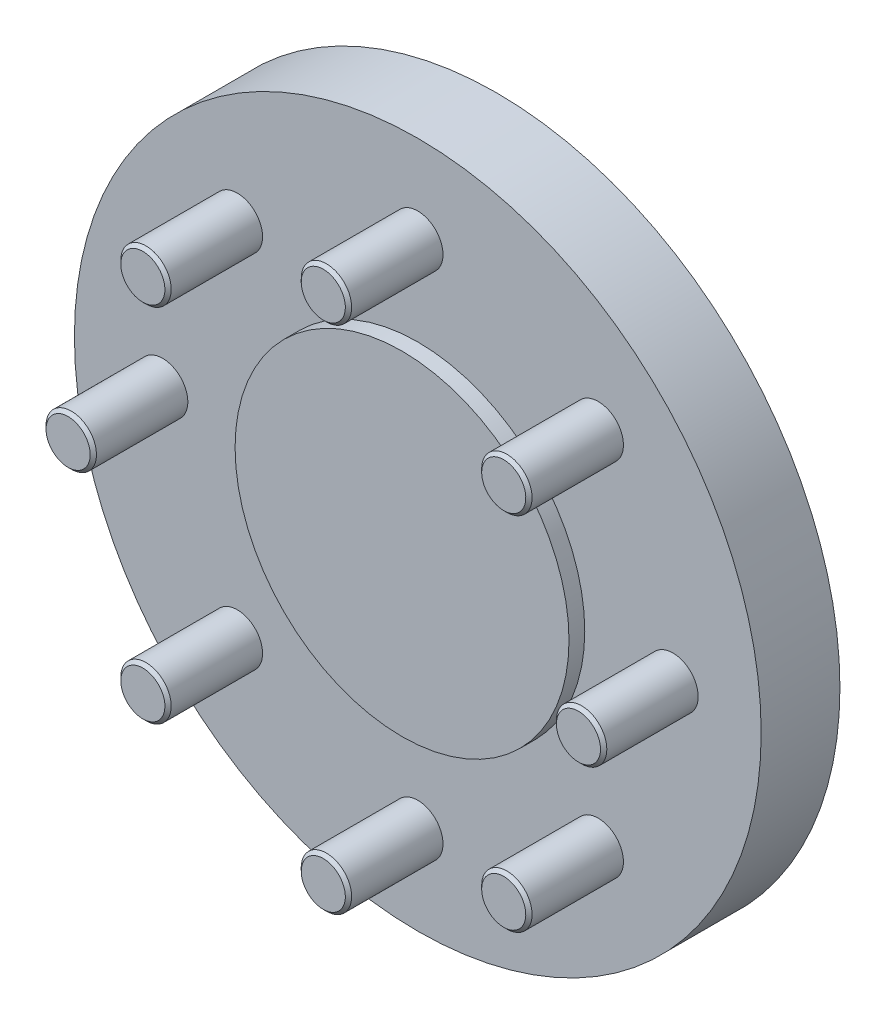
ISO-10303-21;
HEADER;
FILE_DESCRIPTION(('STEP AP214'),'2;1');
FILE_NAME('part.step','',(''),(''),'','','');
FILE_SCHEMA(('AUTOMOTIVE_DESIGN { 1 0 10303 214 1 1 1 1 }'));
ENDSEC;
DATA;
#1=APPLICATION_CONTEXT('core data for automotive mechanical design processes');
#2=APPLICATION_PROTOCOL_DEFINITION('international standard','automotive_design',2000,#1);
#3=PRODUCT_CONTEXT('',#1,'mechanical');
#4=PRODUCT('Part','Part','',(#3));
#5=PRODUCT_RELATED_PRODUCT_CATEGORY('part','',(#4));
#6=PRODUCT_DEFINITION_FORMATION('','',#4);
#7=PRODUCT_DEFINITION_CONTEXT('part definition',#1,'design');
#8=PRODUCT_DEFINITION('design','',#6,#7);
#9=PRODUCT_DEFINITION_SHAPE('','',#8);
#10=(LENGTH_UNIT() NAMED_UNIT(*) SI_UNIT(.MILLI.,.METRE.));
#11=(NAMED_UNIT(*) PLANE_ANGLE_UNIT() SI_UNIT($,.RADIAN.));
#12=(NAMED_UNIT(*) SI_UNIT($,.STERADIAN.) SOLID_ANGLE_UNIT());
#13=UNCERTAINTY_MEASURE_WITH_UNIT(LENGTH_MEASURE(1.E-05),#10,'distance_accuracy_value','');
#14=(GEOMETRIC_REPRESENTATION_CONTEXT(3) GLOBAL_UNCERTAINTY_ASSIGNED_CONTEXT((#13)) GLOBAL_UNIT_ASSIGNED_CONTEXT((#10,
#11,#12)) REPRESENTATION_CONTEXT('',''));
#15=CARTESIAN_POINT('',(0.,0.,0.));
#16=DIRECTION('',(0.,0.,1.));
#17=DIRECTION('',(1.,0.,0.));
#18=AXIS2_PLACEMENT_3D('',#15,#16,#17);
#19=CARTESIAN_POINT('',(53.,0.,0.));
#20=DIRECTION('',(0.,0.,1.));
#21=DIRECTION('',(1.,0.,0.));
#22=AXIS2_PLACEMENT_3D('',#19,#20,#21);
#23=PLANE('',#22);
#24=CARTESIAN_POINT('',(0.,0.,0.));
#25=DIRECTION('',(0.,0.,1.));
#26=DIRECTION('',(1.,0.,0.));
#27=AXIS2_PLACEMENT_3D('',#24,#25,#26);
#28=CIRCLE('',#27,53.);
#29=CARTESIAN_POINT('',(53.,0.,0.));
#30=VERTEX_POINT('',#29);
#31=EDGE_CURVE('E63',#30,#30,#28,.T.);
#32=ORIENTED_EDGE('',*,*,#31,.T.);
#33=EDGE_LOOP('',(#32));
#34=FACE_BOUND('',#33,.T.);
#35=ADVANCED_FACE('F33',(#34),#23,.T.);
#36=CARTESIAN_POINT('',(0.,0.,-75.));
#37=DIRECTION('',(0.,0.,-1.));
#38=DIRECTION('',(-1.,0.,0.));
#39=AXIS2_PLACEMENT_3D('',#36,#37,#38);
#40=PLANE('',#39);
#41=CARTESIAN_POINT('',(0.,0.,-75.));
#42=DIRECTION('',(0.,0.,1.));
#43=DIRECTION('',(1.,0.,0.));
#44=AXIS2_PLACEMENT_3D('',#41,#42,#43);
#45=CIRCLE('',#44,30.);
#46=CARTESIAN_POINT('',(30.,0.,-75.));
#47=VERTEX_POINT('',#46);
#48=EDGE_CURVE('E45',#47,#47,#45,.T.);
#49=ORIENTED_EDGE('',*,*,#48,.F.);
#50=EDGE_LOOP('',(#49));
#51=FACE_BOUND('',#50,.T.);
#52=ADVANCED_FACE('F166',(#51),#40,.T.);
#53=CARTESIAN_POINT('',(0.,0.,0.));
#54=DIRECTION('',(0.,0.,1.));
#55=DIRECTION('',(1.,0.,0.));
#56=AXIS2_PLACEMENT_3D('',#53,#54,#55);
#57=CYLINDRICAL_SURFACE('',#56,30.);
#58=ORIENTED_EDGE('',*,*,#48,.T.);
#59=EDGE_LOOP('',(#58));
#60=FACE_BOUND('',#59,.T.);
#61=CARTESIAN_POINT('',(0.,0.,-30.));
#62=DIRECTION('',(0.,0.,1.));
#63=DIRECTION('',(1.,0.,0.));
#64=AXIS2_PLACEMENT_3D('',#61,#62,#63);
#65=CIRCLE('',#64,30.);
#66=CARTESIAN_POINT('',(30.,0.,-30.));
#67=VERTEX_POINT('',#66);
#68=EDGE_CURVE('E49',#67,#67,#65,.T.);
#69=ORIENTED_EDGE('',*,*,#68,.F.);
#70=EDGE_LOOP('',(#69));
#71=FACE_BOUND('',#70,.T.);
#72=ADVANCED_FACE('F170',(#60,#71),#57,.T.);
#73=CARTESIAN_POINT('',(30.,0.,-30.));
#74=DIRECTION('',(0.,0.,-1.));
#75=DIRECTION('',(-1.,0.,0.));
#76=AXIS2_PLACEMENT_3D('',#73,#74,#75);
#77=PLANE('',#76);
#78=ORIENTED_EDGE('',*,*,#68,.T.);
#79=EDGE_LOOP('',(#78));
#80=FACE_BOUND('',#79,.T.);
#81=CARTESIAN_POINT('',(0.,0.,-30.));
#82=DIRECTION('',(0.,0.,1.));
#83=DIRECTION('',(1.,0.,0.));
#84=AXIS2_PLACEMENT_3D('',#81,#82,#83);
#85=CIRCLE('',#84,109.);
#86=CARTESIAN_POINT('',(109.,0.,-30.));
#87=VERTEX_POINT('',#86);
#88=EDGE_CURVE('E54',#87,#87,#85,.T.);
#89=ORIENTED_EDGE('',*,*,#88,.F.);
#90=EDGE_LOOP('',(#89));
#91=FACE_BOUND('',#90,.T.);
#92=ADVANCED_FACE('F176',(#80,#91),#77,.T.);
#93=CARTESIAN_POINT('',(0.,0.,0.));
#94=DIRECTION('',(0.,0.,1.));
#95=DIRECTION('',(1.,0.,0.));
#96=AXIS2_PLACEMENT_3D('',#93,#94,#95);
#97=CYLINDRICAL_SURFACE('',#96,109.);
#98=ORIENTED_EDGE('',*,*,#88,.T.);
#99=EDGE_LOOP('',(#98));
#100=FACE_BOUND('',#99,.T.);
#101=CARTESIAN_POINT('',(0.,0.,-4.99999999999999));
#102=DIRECTION('',(0.,0.,1.));
#103=DIRECTION('',(1.,0.,0.));
#104=AXIS2_PLACEMENT_3D('',#101,#102,#103);
#105=CIRCLE('',#104,109.);
#106=CARTESIAN_POINT('',(109.,0.,-4.99999999999999));
#107=VERTEX_POINT('',#106);
#108=EDGE_CURVE('E57',#107,#107,#105,.T.);
#109=ORIENTED_EDGE('',*,*,#108,.F.);
#110=EDGE_LOOP('',(#109));
#111=FACE_BOUND('',#110,.T.);
#112=ADVANCED_FACE('F139',(#100,#111),#97,.T.);
#113=CARTESIAN_POINT('',(109.,0.,-4.99999999999999));
#114=DIRECTION('',(0.,0.,1.));
#115=DIRECTION('',(1.,0.,0.));
#116=AXIS2_PLACEMENT_3D('',#113,#114,#115);
#117=PLANE('',#116);
#118=CARTESIAN_POINT('',(57.275649276111,-57.2756492761097,-4.99999999999999));
#119=DIRECTION('',(0.,0.,1.));
#120=DIRECTION('',(0.707106781186556,-0.707106781186539,0.));
#121=AXIS2_PLACEMENT_3D('',#118,#119,#120);
#122=CIRCLE('',#121,8.00000000000001);
#123=CARTESIAN_POINT('',(62.9325035256035,-62.932503525602,-4.99999999999999));
#124=VERTEX_POINT('',#123);
#125=EDGE_CURVE('E129',#124,#124,#122,.T.);
#126=ORIENTED_EDGE('',*,*,#125,.F.);
#127=EDGE_LOOP('',(#126));
#128=FACE_BOUND('',#127,.T.);
#129=CARTESIAN_POINT('',(8.48429965338881E-13,-81.,-4.99999999999999));
#130=DIRECTION('',(0.,0.,1.));
#131=DIRECTION('',(0.,-1.,0.));
#132=AXIS2_PLACEMENT_3D('',#129,#130,#131);
#133=CIRCLE('',#132,8.00000000000001);
#134=CARTESIAN_POINT('',(9.32225517471117E-13,-89.,-4.99999999999999));
#135=VERTEX_POINT('',#134);
#136=EDGE_CURVE('E120',#135,#135,#133,.T.);
#137=ORIENTED_EDGE('',*,*,#136,.F.);
#138=EDGE_LOOP('',(#137));
#139=FACE_BOUND('',#138,.T.);
#140=CARTESIAN_POINT('',(-57.2756492761098,-57.2756492761108,-4.99999999999999));
#141=DIRECTION('',(0.,0.,1.));
#142=DIRECTION('',(-0.707106781186541,-0.707106781186554,0.));
#143=AXIS2_PLACEMENT_3D('',#140,#141,#142);
#144=CIRCLE('',#143,8.00000000000001);
#145=CARTESIAN_POINT('',(-62.9325035256022,-62.9325035256033,-4.99999999999999));
#146=VERTEX_POINT('',#145);
#147=EDGE_CURVE('E111',#146,#146,#144,.T.);
#148=ORIENTED_EDGE('',*,*,#147,.F.);
#149=EDGE_LOOP('',(#148));
#150=FACE_BOUND('',#149,.T.);
#151=CARTESIAN_POINT('',(-81.,0.,-4.99999999999999));
#152=DIRECTION('',(0.,0.,1.));
#153=DIRECTION('',(-1.,0.,0.));
#154=AXIS2_PLACEMENT_3D('',#151,#152,#153);
#155=CIRCLE('',#154,8.00000000000001);
#156=CARTESIAN_POINT('',(-89.,0.,-4.99999999999999));
#157=VERTEX_POINT('',#156);
#158=EDGE_CURVE('E102',#157,#157,#155,.T.);
#159=ORIENTED_EDGE('',*,*,#158,.F.);
#160=EDGE_LOOP('',(#159));
#161=FACE_BOUND('',#160,.T.);
#162=CARTESIAN_POINT('',(-57.2756492761107,57.2756492761101,-4.99999999999999));
#163=DIRECTION('',(0.,0.,1.));
#164=DIRECTION('',(-0.707106781186551,0.707106781186544,0.));
#165=AXIS2_PLACEMENT_3D('',#162,#163,#164);
#166=CIRCLE('',#165,8.00000000000001);
#167=CARTESIAN_POINT('',(-62.9325035256031,62.9325035256024,-4.99999999999999));
#168=VERTEX_POINT('',#167);
#169=EDGE_CURVE('E93',#168,#168,#166,.T.);
#170=ORIENTED_EDGE('',*,*,#169,.F.);
#171=EDGE_LOOP('',(#170));
#172=FACE_BOUND('',#171,.T.);
#173=CARTESIAN_POINT('',(-2.82809988446294E-13,81.,-4.99999999999999));
#174=DIRECTION('',(0.,0.,1.));
#175=DIRECTION('',(0.,1.,0.));
#176=AXIS2_PLACEMENT_3D('',#173,#174,#175);
#177=CIRCLE('',#176,8.00000000000001);
#178=CARTESIAN_POINT('',(-3.10741839157039E-13,89.,-4.99999999999999));
#179=VERTEX_POINT('',#178);
#180=EDGE_CURVE('E84',#179,#179,#177,.T.);
#181=ORIENTED_EDGE('',*,*,#180,.F.);
#182=EDGE_LOOP('',(#181));
#183=FACE_BOUND('',#182,.T.);
#184=CARTESIAN_POINT('',(57.2756492761103,57.2756492761104,-4.99999999999999));
#185=DIRECTION('',(0.,0.,1.));
#186=DIRECTION('',(0.707106781186546,0.707106781186549,0.));
#187=AXIS2_PLACEMENT_3D('',#184,#185,#186);
#188=CIRCLE('',#187,8.00000000000001);
#189=CARTESIAN_POINT('',(62.9325035256026,62.9325035256029,-4.99999999999999));
#190=VERTEX_POINT('',#189);
#191=EDGE_CURVE('E75',#190,#190,#188,.T.);
#192=ORIENTED_EDGE('',*,*,#191,.F.);
#193=EDGE_LOOP('',(#192));
#194=FACE_BOUND('',#193,.T.);
#195=CARTESIAN_POINT('',(81.,0.,-4.99999999999999));
#196=DIRECTION('',(0.,0.,1.));
#197=DIRECTION('',(1.,0.,0.));
#198=AXIS2_PLACEMENT_3D('',#195,#196,#197);
#199=CIRCLE('',#198,8.00000000000001);
#200=CARTESIAN_POINT('',(89.,0.,-4.99999999999999));
#201=VERTEX_POINT('',#200);
#202=EDGE_CURVE('E66',#201,#201,#199,.T.);
#203=ORIENTED_EDGE('',*,*,#202,.F.);
#204=EDGE_LOOP('',(#203));
#205=FACE_BOUND('',#204,.T.);
#206=ORIENTED_EDGE('',*,*,#108,.T.);
#207=EDGE_LOOP('',(#206));
#208=FACE_BOUND('',#207,.T.);
#209=CARTESIAN_POINT('',(0.,0.,-4.99999999999999));
#210=DIRECTION('',(0.,0.,1.));
#211=DIRECTION('',(1.,0.,0.));
#212=AXIS2_PLACEMENT_3D('',#209,#210,#211);
#213=CIRCLE('',#212,53.);
#214=CARTESIAN_POINT('',(53.,0.,-4.99999999999999));
#215=VERTEX_POINT('',#214);
#216=EDGE_CURVE('E60',#215,#215,#213,.T.);
#217=ORIENTED_EDGE('',*,*,#216,.F.);
#218=EDGE_LOOP('',(#217));
#219=FACE_BOUND('',#218,.T.);
#220=ADVANCED_FACE('F135',(#128,#139,#150,#161,#172,#183,#194,#205,#208,#219),#117,.T.);
#221=CARTESIAN_POINT('',(0.,0.,0.));
#222=DIRECTION('',(0.,0.,1.));
#223=DIRECTION('',(1.,0.,0.));
#224=AXIS2_PLACEMENT_3D('',#221,#222,#223);
#225=CYLINDRICAL_SURFACE('',#224,53.);
#226=ORIENTED_EDGE('',*,*,#216,.T.);
#227=EDGE_LOOP('',(#226));
#228=FACE_BOUND('',#227,.T.);
#229=ORIENTED_EDGE('',*,*,#31,.F.);
#230=EDGE_LOOP('',(#229));
#231=FACE_BOUND('',#230,.T.);
#232=ADVANCED_FACE('F138',(#228,#231),#225,.T.);
#233=CARTESIAN_POINT('',(81.,0.,25.));
#234=DIRECTION('',(0.,0.,-1.));
#235=DIRECTION('',(-1.,0.,0.));
#236=AXIS2_PLACEMENT_3D('',#233,#234,#235);
#237=CYLINDRICAL_SURFACE('',#236,8.00000000000001);
#238=CARTESIAN_POINT('',(81.,0.,24.));
#239=DIRECTION('',(0.,0.,1.));
#240=DIRECTION('',(1.,0.,0.));
#241=AXIS2_PLACEMENT_3D('',#238,#239,#240);
#242=CIRCLE('',#241,8.00000000000001);
#243=CARTESIAN_POINT('',(89.,0.,24.));
#244=VERTEX_POINT('',#243);
#245=EDGE_CURVE('E10',#244,#244,#242,.F.);
#246=ORIENTED_EDGE('',*,*,#245,.T.);
#247=EDGE_LOOP('',(#246));
#248=FACE_BOUND('',#247,.T.);
#249=ORIENTED_EDGE('',*,*,#202,.T.);
#250=EDGE_LOOP('',(#249));
#251=FACE_BOUND('',#250,.T.);
#252=ADVANCED_FACE('F161',(#248,#251),#237,.T.);
#253=CARTESIAN_POINT('',(81.,0.,25.));
#254=DIRECTION('',(0.,0.,1.));
#255=DIRECTION('',(1.,0.,0.));
#256=AXIS2_PLACEMENT_3D('',#253,#254,#255);
#257=PLANE('',#256);
#258=CARTESIAN_POINT('',(81.,0.,25.));
#259=DIRECTION('',(0.,0.,1.));
#260=DIRECTION('',(1.,0.,0.));
#261=AXIS2_PLACEMENT_3D('',#258,#259,#260);
#262=CIRCLE('',#261,6.99999999999998);
#263=CARTESIAN_POINT('',(88.,0.,25.));
#264=VERTEX_POINT('',#263);
#265=EDGE_CURVE('E41',#264,#264,#262,.T.);
#266=ORIENTED_EDGE('',*,*,#265,.T.);
#267=EDGE_LOOP('',(#266));
#268=FACE_BOUND('',#267,.T.);
#269=ADVANCED_FACE('F186',(#268),#257,.T.);
#270=CARTESIAN_POINT('',(81.,0.,25.));
#271=DIRECTION('',(0.,0.,-1.));
#272=DIRECTION('',(-1.,0.,0.));
#273=AXIS2_PLACEMENT_3D('',#270,#271,#272);
#274=CONICAL_SURFACE('',#273,6.99999999999998,0.785398163397461);
#275=ORIENTED_EDGE('',*,*,#245,.F.);
#276=EDGE_LOOP('',(#275));
#277=FACE_BOUND('',#276,.T.);
#278=ORIENTED_EDGE('',*,*,#265,.F.);
#279=EDGE_LOOP('',(#278));
#280=FACE_BOUND('',#279,.T.);
#281=ADVANCED_FACE('F36',(#277,#280),#274,.T.);
#282=CARTESIAN_POINT('',(57.2756492761103,57.2756492761104,25.));
#283=DIRECTION('',(0.,0.,-1.));
#284=DIRECTION('',(-0.707106781186546,-0.707106781186549,0.));
#285=AXIS2_PLACEMENT_3D('',#282,#283,#284);
#286=CYLINDRICAL_SURFACE('',#285,8.00000000000001);
#287=CARTESIAN_POINT('',(57.2756492761103,57.2756492761104,24.));
#288=DIRECTION('',(0.,0.,1.));
#289=DIRECTION('',(0.707106781186546,0.707106781186549,0.));
#290=AXIS2_PLACEMENT_3D('',#287,#288,#289);
#291=CIRCLE('',#290,8.00000000000001);
#292=CARTESIAN_POINT('',(62.9325035256026,62.9325035256029,24.));
#293=VERTEX_POINT('',#292);
#294=EDGE_CURVE('E72',#293,#293,#291,.F.);
#295=ORIENTED_EDGE('',*,*,#294,.T.);
#296=EDGE_LOOP('',(#295));
#297=FACE_BOUND('',#296,.T.);
#298=ORIENTED_EDGE('',*,*,#191,.T.);
#299=EDGE_LOOP('',(#298));
#300=FACE_BOUND('',#299,.T.);
#301=ADVANCED_FACE('F189',(#297,#300),#286,.T.);
#302=CARTESIAN_POINT('',(57.2756492761103,57.2756492761104,25.));
#303=DIRECTION('',(0.,0.,1.));
#304=DIRECTION('',(0.707106781186546,0.707106781186549,0.));
#305=AXIS2_PLACEMENT_3D('',#302,#303,#304);
#306=PLANE('',#305);
#307=CARTESIAN_POINT('',(57.2756492761103,57.2756492761104,25.));
#308=DIRECTION('',(0.,0.,1.));
#309=DIRECTION('',(0.707106781186546,0.707106781186549,0.));
#310=AXIS2_PLACEMENT_3D('',#307,#308,#309);
#311=CIRCLE('',#310,6.99999999999998);
#312=CARTESIAN_POINT('',(62.2253967444161,62.2253967444163,25.));
#313=VERTEX_POINT('',#312);
#314=EDGE_CURVE('E69',#313,#313,#311,.T.);
#315=ORIENTED_EDGE('',*,*,#314,.T.);
#316=EDGE_LOOP('',(#315));
#317=FACE_BOUND('',#316,.T.);
#318=ADVANCED_FACE('F192',(#317),#306,.T.);
#319=CARTESIAN_POINT('',(57.2756492761103,57.2756492761104,25.));
#320=DIRECTION('',(0.,0.,-1.));
#321=DIRECTION('',(-0.707106781186546,-0.707106781186549,0.));
#322=AXIS2_PLACEMENT_3D('',#319,#320,#321);
#323=CONICAL_SURFACE('',#322,6.99999999999998,0.785398163397461);
#324=ORIENTED_EDGE('',*,*,#294,.F.);
#325=EDGE_LOOP('',(#324));
#326=FACE_BOUND('',#325,.T.);
#327=ORIENTED_EDGE('',*,*,#314,.F.);
#328=EDGE_LOOP('',(#327));
#329=FACE_BOUND('',#328,.T.);
#330=ADVANCED_FACE('F196',(#326,#329),#323,.T.);
#331=CARTESIAN_POINT('',(-2.82809988446294E-13,81.,25.));
#332=DIRECTION('',(0.,0.,-1.));
#333=DIRECTION('',(0.,-1.,0.));
#334=AXIS2_PLACEMENT_3D('',#331,#332,#333);
#335=CYLINDRICAL_SURFACE('',#334,8.00000000000001);
#336=CARTESIAN_POINT('',(-2.82809988446294E-13,81.,24.));
#337=DIRECTION('',(0.,0.,1.));
#338=DIRECTION('',(0.,1.,0.));
#339=AXIS2_PLACEMENT_3D('',#336,#337,#338);
#340=CIRCLE('',#339,8.00000000000001);
#341=CARTESIAN_POINT('',(-3.10741839157039E-13,89.,24.));
#342=VERTEX_POINT('',#341);
#343=EDGE_CURVE('E81',#342,#342,#340,.F.);
#344=ORIENTED_EDGE('',*,*,#343,.T.);
#345=EDGE_LOOP('',(#344));
#346=FACE_BOUND('',#345,.T.);
#347=ORIENTED_EDGE('',*,*,#180,.T.);
#348=EDGE_LOOP('',(#347));
#349=FACE_BOUND('',#348,.T.);
#350=ADVANCED_FACE('F204',(#346,#349),#335,.T.);
#351=CARTESIAN_POINT('',(-2.82809988446294E-13,81.,25.));
#352=DIRECTION('',(0.,0.,1.));
#353=DIRECTION('',(0.,1.,0.));
#354=AXIS2_PLACEMENT_3D('',#351,#352,#353);
#355=PLANE('',#354);
#356=CARTESIAN_POINT('',(-2.82809988446294E-13,81.,25.));
#357=DIRECTION('',(0.,0.,1.));
#358=DIRECTION('',(0.,1.,0.));
#359=AXIS2_PLACEMENT_3D('',#356,#357,#358);
#360=CIRCLE('',#359,6.99999999999998);
#361=CARTESIAN_POINT('',(-3.07250357818196E-13,88.,25.));
#362=VERTEX_POINT('',#361);
#363=EDGE_CURVE('E78',#362,#362,#360,.T.);
#364=ORIENTED_EDGE('',*,*,#363,.T.);
#365=EDGE_LOOP('',(#364));
#366=FACE_BOUND('',#365,.T.);
#367=ADVANCED_FACE('F208',(#366),#355,.T.);
#368=CARTESIAN_POINT('',(-2.82809988446294E-13,81.,25.));
#369=DIRECTION('',(0.,0.,-1.));
#370=DIRECTION('',(0.,-1.,0.));
#371=AXIS2_PLACEMENT_3D('',#368,#369,#370);
#372=CONICAL_SURFACE('',#371,6.99999999999998,0.785398163397461);
#373=ORIENTED_EDGE('',*,*,#343,.F.);
#374=EDGE_LOOP('',(#373));
#375=FACE_BOUND('',#374,.T.);
#376=ORIENTED_EDGE('',*,*,#363,.F.);
#377=EDGE_LOOP('',(#376));
#378=FACE_BOUND('',#377,.T.);
#379=ADVANCED_FACE('F212',(#375,#378),#372,.T.);
#380=CARTESIAN_POINT('',(-57.2756492761107,57.2756492761101,25.));
#381=DIRECTION('',(0.,0.,-1.));
#382=DIRECTION('',(0.707106781186551,-0.707106781186544,0.));
#383=AXIS2_PLACEMENT_3D('',#380,#381,#382);
#384=CYLINDRICAL_SURFACE('',#383,8.00000000000001);
#385=CARTESIAN_POINT('',(-57.2756492761107,57.2756492761101,24.));
#386=DIRECTION('',(0.,0.,1.));
#387=DIRECTION('',(-0.707106781186551,0.707106781186544,0.));
#388=AXIS2_PLACEMENT_3D('',#385,#386,#387);
#389=CIRCLE('',#388,8.00000000000001);
#390=CARTESIAN_POINT('',(-62.9325035256031,62.9325035256024,24.));
#391=VERTEX_POINT('',#390);
#392=EDGE_CURVE('E90',#391,#391,#389,.F.);
#393=ORIENTED_EDGE('',*,*,#392,.T.);
#394=EDGE_LOOP('',(#393));
#395=FACE_BOUND('',#394,.T.);
#396=ORIENTED_EDGE('',*,*,#169,.T.);
#397=EDGE_LOOP('',(#396));
#398=FACE_BOUND('',#397,.T.);
#399=ADVANCED_FACE('F219',(#395,#398),#384,.T.);
#400=CARTESIAN_POINT('',(-57.2756492761107,57.2756492761101,25.));
#401=DIRECTION('',(0.,0.,1.));
#402=DIRECTION('',(-0.707106781186551,0.707106781186544,0.));
#403=AXIS2_PLACEMENT_3D('',#400,#401,#402);
#404=PLANE('',#403);
#405=CARTESIAN_POINT('',(-57.2756492761107,57.2756492761101,25.));
#406=DIRECTION('',(0.,0.,1.));
#407=DIRECTION('',(-0.707106781186551,0.707106781186544,0.));
#408=AXIS2_PLACEMENT_3D('',#405,#406,#407);
#409=CIRCLE('',#408,6.99999999999998);
#410=CARTESIAN_POINT('',(-62.2253967444165,62.2253967444158,25.));
#411=VERTEX_POINT('',#410);
#412=EDGE_CURVE('E87',#411,#411,#409,.T.);
#413=ORIENTED_EDGE('',*,*,#412,.T.);
#414=EDGE_LOOP('',(#413));
#415=FACE_BOUND('',#414,.T.);
#416=ADVANCED_FACE('F223',(#415),#404,.T.);
#417=CARTESIAN_POINT('',(-57.2756492761107,57.2756492761101,25.));
#418=DIRECTION('',(0.,0.,-1.));
#419=DIRECTION('',(0.707106781186551,-0.707106781186544,0.));
#420=AXIS2_PLACEMENT_3D('',#417,#418,#419);
#421=CONICAL_SURFACE('',#420,6.99999999999998,0.785398163397461);
#422=ORIENTED_EDGE('',*,*,#392,.F.);
#423=EDGE_LOOP('',(#422));
#424=FACE_BOUND('',#423,.T.);
#425=ORIENTED_EDGE('',*,*,#412,.F.);
#426=EDGE_LOOP('',(#425));
#427=FACE_BOUND('',#426,.T.);
#428=ADVANCED_FACE('F227',(#424,#427),#421,.T.);
#429=CARTESIAN_POINT('',(-81.,0.,25.));
#430=DIRECTION('',(0.,0.,-1.));
#431=DIRECTION('',(1.,0.,0.));
#432=AXIS2_PLACEMENT_3D('',#429,#430,#431);
#433=CYLINDRICAL_SURFACE('',#432,8.00000000000001);
#434=CARTESIAN_POINT('',(-81.,0.,24.));
#435=DIRECTION('',(0.,0.,1.));
#436=DIRECTION('',(-1.,0.,0.));
#437=AXIS2_PLACEMENT_3D('',#434,#435,#436);
#438=CIRCLE('',#437,8.00000000000001);
#439=CARTESIAN_POINT('',(-89.,0.,24.));
#440=VERTEX_POINT('',#439);
#441=EDGE_CURVE('E99',#440,#440,#438,.F.);
#442=ORIENTED_EDGE('',*,*,#441,.T.);
#443=EDGE_LOOP('',(#442));
#444=FACE_BOUND('',#443,.T.);
#445=ORIENTED_EDGE('',*,*,#158,.T.);
#446=EDGE_LOOP('',(#445));
#447=FACE_BOUND('',#446,.T.);
#448=ADVANCED_FACE('F234',(#444,#447),#433,.T.);
#449=CARTESIAN_POINT('',(-81.,0.,25.));
#450=DIRECTION('',(0.,0.,1.));
#451=DIRECTION('',(-1.,0.,0.));
#452=AXIS2_PLACEMENT_3D('',#449,#450,#451);
#453=PLANE('',#452);
#454=CARTESIAN_POINT('',(-81.,0.,25.));
#455=DIRECTION('',(0.,0.,1.));
#456=DIRECTION('',(-1.,0.,0.));
#457=AXIS2_PLACEMENT_3D('',#454,#455,#456);
#458=CIRCLE('',#457,6.99999999999998);
#459=CARTESIAN_POINT('',(-88.,0.,25.));
#460=VERTEX_POINT('',#459);
#461=EDGE_CURVE('E96',#460,#460,#458,.T.);
#462=ORIENTED_EDGE('',*,*,#461,.T.);
#463=EDGE_LOOP('',(#462));
#464=FACE_BOUND('',#463,.T.);
#465=ADVANCED_FACE('F238',(#464),#453,.T.);
#466=CARTESIAN_POINT('',(-81.,0.,25.));
#467=DIRECTION('',(0.,0.,-1.));
#468=DIRECTION('',(1.,0.,0.));
#469=AXIS2_PLACEMENT_3D('',#466,#467,#468);
#470=CONICAL_SURFACE('',#469,6.99999999999998,0.785398163397461);
#471=ORIENTED_EDGE('',*,*,#441,.F.);
#472=EDGE_LOOP('',(#471));
#473=FACE_BOUND('',#472,.T.);
#474=ORIENTED_EDGE('',*,*,#461,.F.);
#475=EDGE_LOOP('',(#474));
#476=FACE_BOUND('',#475,.T.);
#477=ADVANCED_FACE('F242',(#473,#476),#470,.T.);
#478=CARTESIAN_POINT('',(-57.2756492761098,-57.2756492761108,25.));
#479=DIRECTION('',(0.,0.,-1.));
#480=DIRECTION('',(0.707106781186541,0.707106781186554,0.));
#481=AXIS2_PLACEMENT_3D('',#478,#479,#480);
#482=CYLINDRICAL_SURFACE('',#481,8.00000000000001);
#483=CARTESIAN_POINT('',(-57.2756492761098,-57.2756492761108,24.));
#484=DIRECTION('',(0.,0.,1.));
#485=DIRECTION('',(-0.707106781186541,-0.707106781186554,0.));
#486=AXIS2_PLACEMENT_3D('',#483,#484,#485);
#487=CIRCLE('',#486,8.00000000000001);
#488=CARTESIAN_POINT('',(-62.9325035256022,-62.9325035256033,24.));
#489=VERTEX_POINT('',#488);
#490=EDGE_CURVE('E108',#489,#489,#487,.F.);
#491=ORIENTED_EDGE('',*,*,#490,.T.);
#492=EDGE_LOOP('',(#491));
#493=FACE_BOUND('',#492,.T.);
#494=ORIENTED_EDGE('',*,*,#147,.T.);
#495=EDGE_LOOP('',(#494));
#496=FACE_BOUND('',#495,.T.);
#497=ADVANCED_FACE('F249',(#493,#496),#482,.T.);
#498=CARTESIAN_POINT('',(-57.2756492761098,-57.2756492761108,25.));
#499=DIRECTION('',(0.,0.,1.));
#500=DIRECTION('',(-0.707106781186541,-0.707106781186554,0.));
#501=AXIS2_PLACEMENT_3D('',#498,#499,#500);
#502=PLANE('',#501);
#503=CARTESIAN_POINT('',(-57.2756492761098,-57.2756492761108,25.));
#504=DIRECTION('',(0.,0.,1.));
#505=DIRECTION('',(-0.707106781186541,-0.707106781186554,0.));
#506=AXIS2_PLACEMENT_3D('',#503,#504,#505);
#507=CIRCLE('',#506,6.99999999999998);
#508=CARTESIAN_POINT('',(-62.2253967444156,-62.2253967444167,25.));
#509=VERTEX_POINT('',#508);
#510=EDGE_CURVE('E105',#509,#509,#507,.T.);
#511=ORIENTED_EDGE('',*,*,#510,.T.);
#512=EDGE_LOOP('',(#511));
#513=FACE_BOUND('',#512,.T.);
#514=ADVANCED_FACE('F253',(#513),#502,.T.);
#515=CARTESIAN_POINT('',(-57.2756492761098,-57.2756492761108,25.));
#516=DIRECTION('',(0.,0.,-1.));
#517=DIRECTION('',(0.707106781186541,0.707106781186554,0.));
#518=AXIS2_PLACEMENT_3D('',#515,#516,#517);
#519=CONICAL_SURFACE('',#518,6.99999999999998,0.785398163397461);
#520=ORIENTED_EDGE('',*,*,#490,.F.);
#521=EDGE_LOOP('',(#520));
#522=FACE_BOUND('',#521,.T.);
#523=ORIENTED_EDGE('',*,*,#510,.F.);
#524=EDGE_LOOP('',(#523));
#525=FACE_BOUND('',#524,.T.);
#526=ADVANCED_FACE('F257',(#522,#525),#519,.T.);
#527=CARTESIAN_POINT('',(8.48429965338881E-13,-81.,25.));
#528=DIRECTION('',(0.,0.,-1.));
#529=DIRECTION('',(0.,1.,0.));
#530=AXIS2_PLACEMENT_3D('',#527,#528,#529);
#531=CYLINDRICAL_SURFACE('',#530,8.00000000000001);
#532=CARTESIAN_POINT('',(8.48429965338881E-13,-81.,24.));
#533=DIRECTION('',(0.,0.,1.));
#534=DIRECTION('',(0.,-1.,0.));
#535=AXIS2_PLACEMENT_3D('',#532,#533,#534);
#536=CIRCLE('',#535,8.00000000000001);
#537=CARTESIAN_POINT('',(9.32225517471117E-13,-89.,24.));
#538=VERTEX_POINT('',#537);
#539=EDGE_CURVE('E117',#538,#538,#536,.F.);
#540=ORIENTED_EDGE('',*,*,#539,.T.);
#541=EDGE_LOOP('',(#540));
#542=FACE_BOUND('',#541,.T.);
#543=ORIENTED_EDGE('',*,*,#136,.T.);
#544=EDGE_LOOP('',(#543));
#545=FACE_BOUND('',#544,.T.);
#546=ADVANCED_FACE('F264',(#542,#545),#531,.T.);
#547=CARTESIAN_POINT('',(8.48429965338881E-13,-81.,25.));
#548=DIRECTION('',(0.,0.,1.));
#549=DIRECTION('',(0.,-1.,0.));
#550=AXIS2_PLACEMENT_3D('',#547,#548,#549);
#551=PLANE('',#550);
#552=CARTESIAN_POINT('',(8.48429965338881E-13,-81.,25.));
#553=DIRECTION('',(0.,0.,1.));
#554=DIRECTION('',(0.,-1.,0.));
#555=AXIS2_PLACEMENT_3D('',#552,#553,#554);
#556=CIRCLE('',#555,6.99999999999998);
#557=CARTESIAN_POINT('',(9.21751073454587E-13,-88.,25.));
#558=VERTEX_POINT('',#557);
#559=EDGE_CURVE('E114',#558,#558,#556,.T.);
#560=ORIENTED_EDGE('',*,*,#559,.T.);
#561=EDGE_LOOP('',(#560));
#562=FACE_BOUND('',#561,.T.);
#563=ADVANCED_FACE('F268',(#562),#551,.T.);
#564=CARTESIAN_POINT('',(8.48429965338881E-13,-81.,25.));
#565=DIRECTION('',(0.,0.,-1.));
#566=DIRECTION('',(0.,1.,0.));
#567=AXIS2_PLACEMENT_3D('',#564,#565,#566);
#568=CONICAL_SURFACE('',#567,6.99999999999998,0.785398163397461);
#569=ORIENTED_EDGE('',*,*,#539,.F.);
#570=EDGE_LOOP('',(#569));
#571=FACE_BOUND('',#570,.T.);
#572=ORIENTED_EDGE('',*,*,#559,.F.);
#573=EDGE_LOOP('',(#572));
#574=FACE_BOUND('',#573,.T.);
#575=ADVANCED_FACE('F272',(#571,#574),#568,.T.);
#576=CARTESIAN_POINT('',(57.275649276111,-57.2756492761097,25.));
#577=DIRECTION('',(0.,0.,-1.));
#578=DIRECTION('',(-0.707106781186556,0.707106781186539,0.));
#579=AXIS2_PLACEMENT_3D('',#576,#577,#578);
#580=CYLINDRICAL_SURFACE('',#579,8.00000000000001);
#581=CARTESIAN_POINT('',(57.275649276111,-57.2756492761097,24.));
#582=DIRECTION('',(0.,0.,1.));
#583=DIRECTION('',(0.707106781186556,-0.707106781186539,0.));
#584=AXIS2_PLACEMENT_3D('',#581,#582,#583);
#585=CIRCLE('',#584,8.00000000000001);
#586=CARTESIAN_POINT('',(62.9325035256035,-62.932503525602,24.));
#587=VERTEX_POINT('',#586);
#588=EDGE_CURVE('E126',#587,#587,#585,.F.);
#589=ORIENTED_EDGE('',*,*,#588,.T.);
#590=EDGE_LOOP('',(#589));
#591=FACE_BOUND('',#590,.T.);
#592=ORIENTED_EDGE('',*,*,#125,.T.);
#593=EDGE_LOOP('',(#592));
#594=FACE_BOUND('',#593,.T.);
#595=ADVANCED_FACE('F133',(#591,#594),#580,.T.);
#596=CARTESIAN_POINT('',(57.275649276111,-57.2756492761097,25.));
#597=DIRECTION('',(0.,0.,1.));
#598=DIRECTION('',(0.707106781186556,-0.707106781186539,0.));
#599=AXIS2_PLACEMENT_3D('',#596,#597,#598);
#600=PLANE('',#599);
#601=CARTESIAN_POINT('',(57.275649276111,-57.2756492761097,25.));
#602=DIRECTION('',(0.,0.,1.));
#603=DIRECTION('',(0.707106781186556,-0.707106781186539,0.));
#604=AXIS2_PLACEMENT_3D('',#601,#602,#603);
#605=CIRCLE('',#604,6.99999999999998);
#606=CARTESIAN_POINT('',(62.2253967444169,-62.2253967444154,25.));
#607=VERTEX_POINT('',#606);
#608=EDGE_CURVE('E123',#607,#607,#605,.T.);
#609=ORIENTED_EDGE('',*,*,#608,.T.);
#610=EDGE_LOOP('',(#609));
#611=FACE_BOUND('',#610,.T.);
#612=ADVANCED_FACE('F282',(#611),#600,.T.);
#613=CARTESIAN_POINT('',(57.275649276111,-57.2756492761097,25.));
#614=DIRECTION('',(0.,0.,-1.));
#615=DIRECTION('',(-0.707106781186556,0.707106781186539,0.));
#616=AXIS2_PLACEMENT_3D('',#613,#614,#615);
#617=CONICAL_SURFACE('',#616,6.99999999999998,0.785398163397461);
#618=ORIENTED_EDGE('',*,*,#588,.F.);
#619=EDGE_LOOP('',(#618));
#620=FACE_BOUND('',#619,.T.);
#621=ORIENTED_EDGE('',*,*,#608,.F.);
#622=EDGE_LOOP('',(#621));
#623=FACE_BOUND('',#622,.T.);
#624=ADVANCED_FACE('F286',(#620,#623),#617,.T.);
#625=CLOSED_SHELL('',(#35,#52,#72,#92,#112,#220,#232,#252,#269,#281,#301,#318,#330,#350,#367,
#379,#399,#416,#428,#448,#465,#477,#497,#514,#526,#546,#563,#575,#595,#612,#624));
#626=MANIFOLD_SOLID_BREP('B2',#625);
#627=ADVANCED_BREP_SHAPE_REPRESENTATION('',(#18,#626),#14);
#628=SHAPE_DEFINITION_REPRESENTATION(#9,#627);
ENDSEC;
END-ISO-10303-21;
